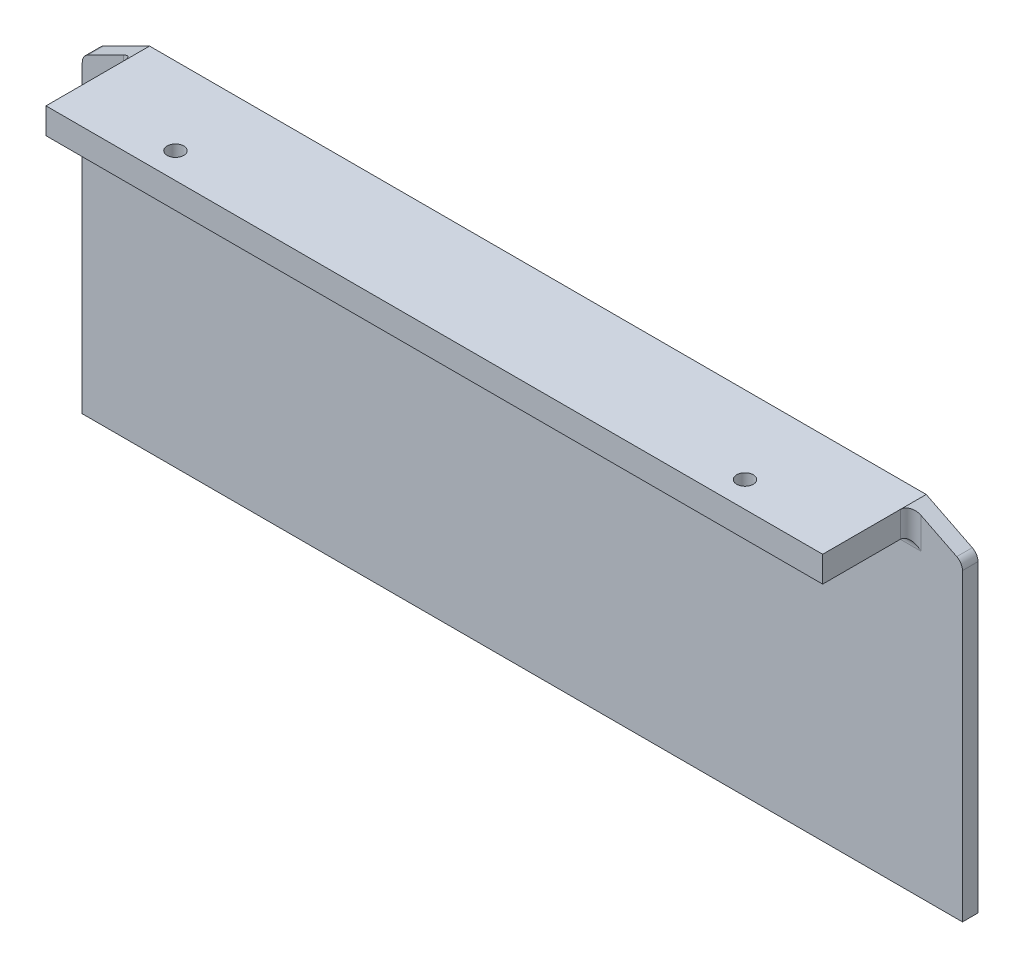
ISO-10303-21;
HEADER;
FILE_DESCRIPTION(('STEP AP214'),'2;1');
FILE_NAME('part.step','',(''),(''),'','','');
FILE_SCHEMA(('AUTOMOTIVE_DESIGN { 1 0 10303 214 1 1 1 1 }'));
ENDSEC;
DATA;
#1=APPLICATION_CONTEXT('core data for automotive mechanical design processes');
#2=APPLICATION_PROTOCOL_DEFINITION('international standard','automotive_design',2000,#1);
#3=PRODUCT_CONTEXT('',#1,'mechanical');
#4=PRODUCT('Part','Part','',(#3));
#5=PRODUCT_RELATED_PRODUCT_CATEGORY('part','',(#4));
#6=PRODUCT_DEFINITION_FORMATION('','',#4);
#7=PRODUCT_DEFINITION_CONTEXT('part definition',#1,'design');
#8=PRODUCT_DEFINITION('design','',#6,#7);
#9=PRODUCT_DEFINITION_SHAPE('','',#8);
#10=(LENGTH_UNIT() NAMED_UNIT(*) SI_UNIT(.MILLI.,.METRE.));
#11=(NAMED_UNIT(*) PLANE_ANGLE_UNIT() SI_UNIT($,.RADIAN.));
#12=(NAMED_UNIT(*) SI_UNIT($,.STERADIAN.) SOLID_ANGLE_UNIT());
#13=UNCERTAINTY_MEASURE_WITH_UNIT(LENGTH_MEASURE(1.E-05),#10,'distance_accuracy_value','');
#14=(GEOMETRIC_REPRESENTATION_CONTEXT(3) GLOBAL_UNCERTAINTY_ASSIGNED_CONTEXT((#13)) GLOBAL_UNIT_ASSIGNED_CONTEXT((#10,
#11,#12)) REPRESENTATION_CONTEXT('',''));
#15=CARTESIAN_POINT('',(0.,0.,0.));
#16=DIRECTION('',(0.,0.,1.));
#17=DIRECTION('',(1.,0.,0.));
#18=AXIS2_PLACEMENT_3D('',#15,#16,#17);
#19=CARTESIAN_POINT('',(0.,5.,0.));
#20=DIRECTION('',(0.,-1.,0.));
#21=DIRECTION('',(0.,0.,-1.));
#22=AXIS2_PLACEMENT_3D('',#19,#20,#21);
#23=PLANE('',#22);
#24=DIRECTION('',(0.,0.,-1.));
#25=VECTOR('',#24,1.);
#26=CARTESIAN_POINT('',(75.,5.,10.));
#27=LINE('',#26,#25);
#28=CARTESIAN_POINT('',(75.,5.,10.));
#29=VERTEX_POINT('',#28);
#30=CARTESIAN_POINT('',(75.,5.,-5.));
#31=VERTEX_POINT('',#30);
#32=EDGE_CURVE('E205',#29,#31,#27,.T.);
#33=ORIENTED_EDGE('',*,*,#32,.T.);
#34=CARTESIAN_POINT('',(75.,5.,-10.));
#35=VERTEX_POINT('',#34);
#36=EDGE_CURVE('E75',#31,#35,#27,.T.);
#37=ORIENTED_EDGE('',*,*,#36,.T.);
#38=DIRECTION('',(-1.,0.,0.));
#39=VECTOR('',#38,1.);
#40=CARTESIAN_POINT('',(-75.,5.,-10.));
#41=LINE('',#40,#39);
#42=CARTESIAN_POINT('',(-75.,5.,-10.));
#43=VERTEX_POINT('',#42);
#44=EDGE_CURVE('E138',#35,#43,#41,.T.);
#45=ORIENTED_EDGE('',*,*,#44,.T.);
#46=DIRECTION('',(0.,0.,1.));
#47=VECTOR('',#46,1.);
#48=CARTESIAN_POINT('',(-75.,5.,10.));
#49=LINE('',#48,#47);
#50=CARTESIAN_POINT('',(-75.,5.,-5.));
#51=VERTEX_POINT('',#50);
#52=EDGE_CURVE('E52',#43,#51,#49,.T.);
#53=ORIENTED_EDGE('',*,*,#52,.T.);
#54=CARTESIAN_POINT('',(-75.,5.,10.));
#55=VERTEX_POINT('',#54);
#56=EDGE_CURVE('E209',#51,#55,#49,.T.);
#57=ORIENTED_EDGE('',*,*,#56,.T.);
#58=DIRECTION('',(1.,0.,0.));
#59=VECTOR('',#58,1.);
#60=CARTESIAN_POINT('',(-75.,5.,10.));
#61=LINE('',#60,#59);
#62=EDGE_CURVE('E211',#55,#29,#61,.T.);
#63=ORIENTED_EDGE('',*,*,#62,.T.);
#64=EDGE_LOOP('',(#33,#37,#45,#53,#57,#63));
#65=FACE_BOUND('',#64,.T.);
#66=CARTESIAN_POINT('',(-55.,5.,5.));
#67=DIRECTION('',(0.,1.,0.));
#68=DIRECTION('',(0.,0.,1.));
#69=AXIS2_PLACEMENT_3D('',#66,#67,#68);
#70=CIRCLE('',#69,1.60000000000001);
#71=CARTESIAN_POINT('',(-55.,5.,6.6));
#72=VERTEX_POINT('',#71);
#73=EDGE_CURVE('E199',#72,#72,#70,.T.);
#74=ORIENTED_EDGE('',*,*,#73,.F.);
#75=EDGE_LOOP('',(#74));
#76=FACE_BOUND('',#75,.T.);
#77=CARTESIAN_POINT('',(55.,5.,5.));
#78=DIRECTION('',(0.,1.,0.));
#79=DIRECTION('',(0.,0.,1.));
#80=AXIS2_PLACEMENT_3D('',#77,#78,#79);
#81=CIRCLE('',#80,1.6);
#82=CARTESIAN_POINT('',(55.,5.,6.6));
#83=VERTEX_POINT('',#82);
#84=EDGE_CURVE('E193',#83,#83,#81,.T.);
#85=ORIENTED_EDGE('',*,*,#84,.F.);
#86=EDGE_LOOP('',(#85));
#87=FACE_BOUND('',#86,.T.);
#88=ADVANCED_FACE('F35',(#65,#76,#87),#23,.F.);
#89=CARTESIAN_POINT('',(0.,0.,0.));
#90=DIRECTION('',(0.,-1.,0.));
#91=DIRECTION('',(0.,0.,-1.));
#92=AXIS2_PLACEMENT_3D('',#89,#90,#91);
#93=PLANE('',#92);
#94=DIRECTION('',(0.,0.,1.));
#95=VECTOR('',#94,1.);
#96=CARTESIAN_POINT('',(-75.,0.,10.));
#97=LINE('',#96,#95);
#98=CARTESIAN_POINT('',(-75.,0.,-5.));
#99=VERTEX_POINT('',#98);
#100=CARTESIAN_POINT('',(-75.,0.,10.));
#101=VERTEX_POINT('',#100);
#102=EDGE_CURVE('E215',#99,#101,#97,.T.);
#103=ORIENTED_EDGE('',*,*,#102,.F.);
#104=DIRECTION('',(-1.,0.,0.));
#105=VECTOR('',#104,1.);
#106=CARTESIAN_POINT('',(0.,0.,-5.));
#107=LINE('',#106,#105);
#108=CARTESIAN_POINT('',(75.,0.,-5.));
#109=VERTEX_POINT('',#108);
#110=EDGE_CURVE('E87',#99,#109,#107,.F.);
#111=ORIENTED_EDGE('',*,*,#110,.T.);
#112=DIRECTION('',(0.,0.,-1.));
#113=VECTOR('',#112,1.);
#114=CARTESIAN_POINT('',(75.,0.,10.));
#115=LINE('',#114,#113);
#116=CARTESIAN_POINT('',(75.,0.,10.));
#117=VERTEX_POINT('',#116);
#118=EDGE_CURVE('E202',#117,#109,#115,.T.);
#119=ORIENTED_EDGE('',*,*,#118,.F.);
#120=DIRECTION('',(1.,0.,0.));
#121=VECTOR('',#120,1.);
#122=CARTESIAN_POINT('',(-75.,0.,10.));
#123=LINE('',#122,#121);
#124=EDGE_CURVE('E218',#101,#117,#123,.T.);
#125=ORIENTED_EDGE('',*,*,#124,.F.);
#126=EDGE_LOOP('',(#103,#111,#119,#125));
#127=FACE_BOUND('',#126,.T.);
#128=CARTESIAN_POINT('',(-55.,0.,5.));
#129=DIRECTION('',(0.,1.,0.));
#130=DIRECTION('',(0.,0.,1.));
#131=AXIS2_PLACEMENT_3D('',#128,#129,#130);
#132=CIRCLE('',#131,1.60000000000001);
#133=CARTESIAN_POINT('',(-55.,0.,6.6));
#134=VERTEX_POINT('',#133);
#135=EDGE_CURVE('E196',#134,#134,#132,.T.);
#136=ORIENTED_EDGE('',*,*,#135,.T.);
#137=EDGE_LOOP('',(#136));
#138=FACE_BOUND('',#137,.T.);
#139=CARTESIAN_POINT('',(55.,0.,5.));
#140=DIRECTION('',(0.,1.,0.));
#141=DIRECTION('',(0.,0.,1.));
#142=AXIS2_PLACEMENT_3D('',#139,#140,#141);
#143=CIRCLE('',#142,1.6);
#144=CARTESIAN_POINT('',(55.,0.,6.6));
#145=VERTEX_POINT('',#144);
#146=EDGE_CURVE('E192',#145,#145,#143,.T.);
#147=ORIENTED_EDGE('',*,*,#146,.T.);
#148=EDGE_LOOP('',(#147));
#149=FACE_BOUND('',#148,.T.);
#150=ADVANCED_FACE('F251',(#127,#138,#149),#93,.T.);
#151=CARTESIAN_POINT('',(75.,5.,10.));
#152=DIRECTION('',(-1.,0.,0.));
#153=DIRECTION('',(0.,0.,1.));
#154=AXIS2_PLACEMENT_3D('',#151,#152,#153);
#155=PLANE('',#154);
#156=ORIENTED_EDGE('',*,*,#118,.T.);
#157=DIRECTION('',(0.,1.,0.));
#158=VECTOR('',#157,1.);
#159=CARTESIAN_POINT('',(75.,5.,-5.));
#160=LINE('',#159,#158);
#161=EDGE_CURVE('E231',#109,#31,#160,.T.);
#162=ORIENTED_EDGE('',*,*,#161,.T.);
#163=ORIENTED_EDGE('',*,*,#32,.F.);
#164=DIRECTION('',(0.,-1.,0.));
#165=VECTOR('',#164,1.);
#166=CARTESIAN_POINT('',(75.,5.,10.));
#167=LINE('',#166,#165);
#168=EDGE_CURVE('E213',#29,#117,#167,.T.);
#169=ORIENTED_EDGE('',*,*,#168,.T.);
#170=EDGE_LOOP('',(#156,#162,#163,#169));
#171=FACE_BOUND('',#170,.T.);
#172=ADVANCED_FACE('F259',(#171),#155,.F.);
#173=CARTESIAN_POINT('',(-75.,5.,-10.));
#174=DIRECTION('',(0.,0.,1.));
#175=DIRECTION('',(1.,0.,0.));
#176=AXIS2_PLACEMENT_3D('',#173,#174,#175);
#177=PLANE('',#176);
#178=DIRECTION('',(0.,1.,0.));
#179=VECTOR('',#178,1.);
#180=CARTESIAN_POINT('',(-85.,-60.,-10.));
#181=LINE('',#180,#179);
#182=CARTESIAN_POINT('',(-85.,-60.,-10.));
#183=VERTEX_POINT('',#182);
#184=CARTESIAN_POINT('',(-85.,-1.23606797749983,-10.));
#185=VERTEX_POINT('',#184);
#186=EDGE_CURVE('E190',#183,#185,#181,.T.);
#187=ORIENTED_EDGE('',*,*,#186,.T.);
#188=CARTESIAN_POINT('',(-83.,-1.23606797749983,-10.));
#189=DIRECTION('',(0.,0.,1.));
#190=DIRECTION('',(1.,0.,0.));
#191=AXIS2_PLACEMENT_3D('',#188,#189,#190);
#192=CIRCLE('',#191,2.);
#193=CARTESIAN_POINT('',(-83.8944271909999,0.552786404499994,-10.));
#194=VERTEX_POINT('',#193);
#195=EDGE_CURVE('E61',#185,#194,#192,.F.);
#196=ORIENTED_EDGE('',*,*,#195,.T.);
#197=DIRECTION('',(0.894427190999914,0.447213595499962,0.));
#198=VECTOR('',#197,1.);
#199=CARTESIAN_POINT('',(-75.,5.,-10.));
#200=LINE('',#199,#198);
#201=EDGE_CURVE('E139',#194,#43,#200,.T.);
#202=ORIENTED_EDGE('',*,*,#201,.T.);
#203=ORIENTED_EDGE('',*,*,#44,.F.);
#204=DIRECTION('',(0.894427190999914,-0.447213595499962,0.));
#205=VECTOR('',#204,1.);
#206=CARTESIAN_POINT('',(-44.9999999999995,65.0000000000004,-10.));
#207=LINE('',#206,#205);
#208=CARTESIAN_POINT('',(83.8944271909999,0.552786404499975,-10.));
#209=VERTEX_POINT('',#208);
#210=EDGE_CURVE('E126',#35,#209,#207,.T.);
#211=ORIENTED_EDGE('',*,*,#210,.T.);
#212=CARTESIAN_POINT('',(83.,-1.23606797749984,-10.));
#213=DIRECTION('',(0.,0.,1.));
#214=DIRECTION('',(1.,0.,0.));
#215=AXIS2_PLACEMENT_3D('',#212,#213,#214);
#216=CIRCLE('',#215,2.);
#217=CARTESIAN_POINT('',(85.,-1.23606797749984,-10.));
#218=VERTEX_POINT('',#217);
#219=EDGE_CURVE('E136',#209,#218,#216,.F.);
#220=ORIENTED_EDGE('',*,*,#219,.T.);
#221=DIRECTION('',(0.,1.,0.));
#222=VECTOR('',#221,1.);
#223=CARTESIAN_POINT('',(85.,-60.,-10.));
#224=LINE('',#223,#222);
#225=CARTESIAN_POINT('',(85.,-60.,-10.));
#226=VERTEX_POINT('',#225);
#227=EDGE_CURVE('E188',#226,#218,#224,.T.);
#228=ORIENTED_EDGE('',*,*,#227,.F.);
#229=DIRECTION('',(1.,0.,0.));
#230=VECTOR('',#229,1.);
#231=CARTESIAN_POINT('',(-85.,-60.,-10.));
#232=LINE('',#231,#230);
#233=EDGE_CURVE('E167',#183,#226,#232,.T.);
#234=ORIENTED_EDGE('',*,*,#233,.F.);
#235=EDGE_LOOP('',(#187,#196,#202,#203,#211,#220,#228,#234));
#236=FACE_BOUND('',#235,.T.);
#237=ADVANCED_FACE('F134',(#236),#177,.F.);
#238=CARTESIAN_POINT('',(-75.,5.,10.));
#239=DIRECTION('',(1.,0.,0.));
#240=DIRECTION('',(0.,0.,-1.));
#241=AXIS2_PLACEMENT_3D('',#238,#239,#240);
#242=PLANE('',#241);
#243=ORIENTED_EDGE('',*,*,#56,.F.);
#244=DIRECTION('',(0.,-1.,0.));
#245=VECTOR('',#244,1.);
#246=CARTESIAN_POINT('',(-75.,0.,-5.));
#247=LINE('',#246,#245);
#248=EDGE_CURVE('E148',#51,#99,#247,.T.);
#249=ORIENTED_EDGE('',*,*,#248,.T.);
#250=ORIENTED_EDGE('',*,*,#102,.T.);
#251=DIRECTION('',(0.,-1.,0.));
#252=VECTOR('',#251,1.);
#253=CARTESIAN_POINT('',(-75.,5.,10.));
#254=LINE('',#253,#252);
#255=EDGE_CURVE('E223',#55,#101,#254,.T.);
#256=ORIENTED_EDGE('',*,*,#255,.F.);
#257=EDGE_LOOP('',(#243,#249,#250,#256));
#258=FACE_BOUND('',#257,.T.);
#259=ADVANCED_FACE('F245',(#258),#242,.F.);
#260=CARTESIAN_POINT('',(-75.,5.,10.));
#261=DIRECTION('',(0.,0.,-1.));
#262=DIRECTION('',(-1.,0.,0.));
#263=AXIS2_PLACEMENT_3D('',#260,#261,#262);
#264=PLANE('',#263);
#265=ORIENTED_EDGE('',*,*,#124,.T.);
#266=ORIENTED_EDGE('',*,*,#168,.F.);
#267=ORIENTED_EDGE('',*,*,#62,.F.);
#268=ORIENTED_EDGE('',*,*,#255,.T.);
#269=EDGE_LOOP('',(#265,#266,#267,#268));
#270=FACE_BOUND('',#269,.T.);
#271=ADVANCED_FACE('F264',(#270),#264,.F.);
#272=CARTESIAN_POINT('',(-55.,5.,5.));
#273=DIRECTION('',(0.,-1.,0.));
#274=DIRECTION('',(0.,0.,-1.));
#275=AXIS2_PLACEMENT_3D('',#272,#273,#274);
#276=CYLINDRICAL_SURFACE('',#275,1.60000000000001);
#277=ORIENTED_EDGE('',*,*,#73,.T.);
#278=EDGE_LOOP('',(#277));
#279=FACE_BOUND('',#278,.T.);
#280=ORIENTED_EDGE('',*,*,#135,.F.);
#281=EDGE_LOOP('',(#280));
#282=FACE_BOUND('',#281,.T.);
#283=ADVANCED_FACE('F313',(#279,#282),#276,.F.);
#284=CARTESIAN_POINT('',(55.,5.,5.));
#285=DIRECTION('',(0.,-1.,0.));
#286=DIRECTION('',(0.,0.,-1.));
#287=AXIS2_PLACEMENT_3D('',#284,#285,#286);
#288=CYLINDRICAL_SURFACE('',#287,1.6);
#289=ORIENTED_EDGE('',*,*,#84,.T.);
#290=EDGE_LOOP('',(#289));
#291=FACE_BOUND('',#290,.T.);
#292=ORIENTED_EDGE('',*,*,#146,.F.);
#293=EDGE_LOOP('',(#292));
#294=FACE_BOUND('',#293,.T.);
#295=ADVANCED_FACE('F345',(#291,#294),#288,.F.);
#296=CARTESIAN_POINT('',(-85.,-60.,-10.));
#297=DIRECTION('',(1.,0.,0.));
#298=DIRECTION('',(0.,0.,-1.));
#299=AXIS2_PLACEMENT_3D('',#296,#297,#298);
#300=PLANE('',#299);
#301=DIRECTION('',(0.,1.,0.));
#302=VECTOR('',#301,1.);
#303=CARTESIAN_POINT('',(-85.,-60.,-7.));
#304=LINE('',#303,#302);
#305=CARTESIAN_POINT('',(-85.,-60.,-7.));
#306=VERTEX_POINT('',#305);
#307=CARTESIAN_POINT('',(-85.,-1.23606797749982,-7.));
#308=VERTEX_POINT('',#307);
#309=EDGE_CURVE('E182',#306,#308,#304,.T.);
#310=ORIENTED_EDGE('',*,*,#309,.T.);
#311=DIRECTION('',(0.,0.,-1.));
#312=VECTOR('',#311,1.);
#313=CARTESIAN_POINT('',(-85.,-1.23606797749983,-10.0000000000001));
#314=LINE('',#313,#312);
#315=EDGE_CURVE('E143',#308,#185,#314,.T.);
#316=ORIENTED_EDGE('',*,*,#315,.T.);
#317=ORIENTED_EDGE('',*,*,#186,.F.);
#318=DIRECTION('',(0.,0.,-1.));
#319=VECTOR('',#318,1.);
#320=CARTESIAN_POINT('',(-85.,-60.,-10.));
#321=LINE('',#320,#319);
#322=EDGE_CURVE('E162',#306,#183,#321,.T.);
#323=ORIENTED_EDGE('',*,*,#322,.F.);
#324=EDGE_LOOP('',(#310,#316,#317,#323));
#325=FACE_BOUND('',#324,.T.);
#326=ADVANCED_FACE('F289',(#325),#300,.F.);
#327=CARTESIAN_POINT('',(85.,-60.,-10.));
#328=DIRECTION('',(-1.,0.,0.));
#329=DIRECTION('',(0.,0.,1.));
#330=AXIS2_PLACEMENT_3D('',#327,#328,#329);
#331=PLANE('',#330);
#332=ORIENTED_EDGE('',*,*,#227,.T.);
#333=DIRECTION('',(0.,0.,1.));
#334=VECTOR('',#333,1.);
#335=CARTESIAN_POINT('',(85.,-1.23606797749984,-10.0000000000001));
#336=LINE('',#335,#334);
#337=CARTESIAN_POINT('',(85.,-1.23606797749983,-7.));
#338=VERTEX_POINT('',#337);
#339=EDGE_CURVE('E131',#218,#338,#336,.T.);
#340=ORIENTED_EDGE('',*,*,#339,.T.);
#341=DIRECTION('',(0.,1.,0.));
#342=VECTOR('',#341,1.);
#343=CARTESIAN_POINT('',(85.,-60.,-7.));
#344=LINE('',#343,#342);
#345=CARTESIAN_POINT('',(85.,-60.,-7.));
#346=VERTEX_POINT('',#345);
#347=EDGE_CURVE('E185',#346,#338,#344,.T.);
#348=ORIENTED_EDGE('',*,*,#347,.F.);
#349=DIRECTION('',(0.,0.,1.));
#350=VECTOR('',#349,1.);
#351=CARTESIAN_POINT('',(85.,-60.,-10.));
#352=LINE('',#351,#350);
#353=EDGE_CURVE('E175',#226,#346,#352,.T.);
#354=ORIENTED_EDGE('',*,*,#353,.F.);
#355=EDGE_LOOP('',(#332,#340,#348,#354));
#356=FACE_BOUND('',#355,.T.);
#357=ADVANCED_FACE('F283',(#356),#331,.F.);
#358=CARTESIAN_POINT('',(-85.,-60.,-7.));
#359=DIRECTION('',(0.,0.,-1.));
#360=DIRECTION('',(-1.,0.,0.));
#361=AXIS2_PLACEMENT_3D('',#358,#359,#360);
#362=PLANE('',#361);
#363=DIRECTION('',(-0.894427190999914,-0.447213595499962,0.));
#364=VECTOR('',#363,1.);
#365=CARTESIAN_POINT('',(-109.,-12.0000000000002,-7.));
#366=LINE('',#365,#364);
#367=CARTESIAN_POINT('',(-77.,3.99999999999999,-7.));
#368=VERTEX_POINT('',#367);
#369=CARTESIAN_POINT('',(-83.8944271909999,0.552786404500001,-7.));
#370=VERTEX_POINT('',#369);
#371=EDGE_CURVE('E226',#368,#370,#366,.T.);
#372=ORIENTED_EDGE('',*,*,#371,.T.);
#373=CARTESIAN_POINT('',(-83.,-1.23606797749982,-7.));
#374=DIRECTION('',(0.,0.,-1.));
#375=DIRECTION('',(-1.,0.,0.));
#376=AXIS2_PLACEMENT_3D('',#373,#374,#375);
#377=CIRCLE('',#376,2.);
#378=EDGE_CURVE('E242',#370,#308,#377,.F.);
#379=ORIENTED_EDGE('',*,*,#378,.T.);
#380=ORIENTED_EDGE('',*,*,#309,.F.);
#381=DIRECTION('',(-1.,0.,0.));
#382=VECTOR('',#381,1.);
#383=CARTESIAN_POINT('',(-85.,-60.,-7.));
#384=LINE('',#383,#382);
#385=EDGE_CURVE('E180',#346,#306,#384,.T.);
#386=ORIENTED_EDGE('',*,*,#385,.F.);
#387=ORIENTED_EDGE('',*,*,#347,.T.);
#388=CARTESIAN_POINT('',(83.,-1.23606797749983,-7.));
#389=DIRECTION('',(0.,0.,-1.));
#390=DIRECTION('',(-1.,0.,0.));
#391=AXIS2_PLACEMENT_3D('',#388,#389,#390);
#392=CIRCLE('',#391,2.);
#393=CARTESIAN_POINT('',(83.8944271909999,0.552786404500002,-7.));
#394=VERTEX_POINT('',#393);
#395=EDGE_CURVE('E234',#338,#394,#392,.F.);
#396=ORIENTED_EDGE('',*,*,#395,.T.);
#397=DIRECTION('',(-0.894427190999914,0.447213595499962,0.));
#398=VECTOR('',#397,1.);
#399=CARTESIAN_POINT('',(-26.9999999999993,56.0000000000002,-7.));
#400=LINE('',#399,#398);
#401=CARTESIAN_POINT('',(77.,4.,-7.));
#402=VERTEX_POINT('',#401);
#403=EDGE_CURVE('E128',#394,#402,#400,.T.);
#404=ORIENTED_EDGE('',*,*,#403,.T.);
#405=DIRECTION('',(0.,1.,0.));
#406=VECTOR('',#405,1.);
#407=CARTESIAN_POINT('',(77.,0.,-7.));
#408=LINE('',#407,#406);
#409=CARTESIAN_POINT('',(77.,-2.,-7.));
#410=VERTEX_POINT('',#409);
#411=EDGE_CURVE('E240',#402,#410,#408,.F.);
#412=ORIENTED_EDGE('',*,*,#411,.T.);
#413=DIRECTION('',(-1.,0.,0.));
#414=VECTOR('',#413,1.);
#415=CARTESIAN_POINT('',(-85.,-2.,-7.));
#416=LINE('',#415,#414);
#417=CARTESIAN_POINT('',(-77.,-2.,-7.));
#418=VERTEX_POINT('',#417);
#419=EDGE_CURVE('E236',#410,#418,#416,.T.);
#420=ORIENTED_EDGE('',*,*,#419,.T.);
#421=DIRECTION('',(0.,-1.,0.));
#422=VECTOR('',#421,1.);
#423=CARTESIAN_POINT('',(-77.,5.,-7.));
#424=LINE('',#423,#422);
#425=EDGE_CURVE('E238',#418,#368,#424,.F.);
#426=ORIENTED_EDGE('',*,*,#425,.T.);
#427=EDGE_LOOP('',(#372,#379,#380,#386,#387,#396,#404,#412,#420,#426));
#428=FACE_BOUND('',#427,.T.);
#429=ADVANCED_FACE('F285',(#428),#362,.F.);
#430=CARTESIAN_POINT('',(0.,-60.,0.));
#431=DIRECTION('',(0.,1.,0.));
#432=DIRECTION('',(0.,0.,1.));
#433=AXIS2_PLACEMENT_3D('',#430,#431,#432);
#434=PLANE('',#433);
#435=ORIENTED_EDGE('',*,*,#322,.T.);
#436=ORIENTED_EDGE('',*,*,#233,.T.);
#437=ORIENTED_EDGE('',*,*,#353,.T.);
#438=ORIENTED_EDGE('',*,*,#385,.T.);
#439=EDGE_LOOP('',(#435,#436,#437,#438));
#440=FACE_BOUND('',#439,.T.);
#441=ADVANCED_FACE('F278',(#440),#434,.F.);
#442=CARTESIAN_POINT('',(-75.,5.,10.));
#443=DIRECTION('',(0.447213595499962,-0.894427190999914,0.));
#444=DIRECTION('',(0.,0.,1.));
#445=AXIS2_PLACEMENT_3D('',#442,#443,#444);
#446=PLANE('',#445);
#447=ORIENTED_EDGE('',*,*,#201,.F.);
#448=DIRECTION('',(0.,0.,-1.));
#449=VECTOR('',#448,1.);
#450=CARTESIAN_POINT('',(-83.8944271909998,0.552786404500041,10.0000000000001));
#451=LINE('',#450,#449);
#452=EDGE_CURVE('E145',#194,#370,#451,.F.);
#453=ORIENTED_EDGE('',*,*,#452,.T.);
#454=ORIENTED_EDGE('',*,*,#371,.F.);
#455=CARTESIAN_POINT('',(-77.,3.99999999999999,-5.));
#456=DIRECTION('',(0.447213595499962,-0.894427190999914,0.));
#457=DIRECTION('',(0.894427190999914,0.447213595499962,0.));
#458=AXIS2_PLACEMENT_3D('',#455,#456,#457);
#459=ELLIPSE('',#458,2.23606797749979,2.);
#460=EDGE_CURVE('E11',#368,#51,#459,.T.);
#461=ORIENTED_EDGE('',*,*,#460,.T.);
#462=ORIENTED_EDGE('',*,*,#52,.F.);
#463=EDGE_LOOP('',(#447,#453,#454,#461,#462));
#464=FACE_BOUND('',#463,.T.);
#465=ADVANCED_FACE('F295',(#464),#446,.F.);
#466=CARTESIAN_POINT('',(75.,5.,10.));
#467=DIRECTION('',(-0.447213595499962,-0.894427190999914,0.));
#468=DIRECTION('',(0.,0.,-1.));
#469=AXIS2_PLACEMENT_3D('',#466,#467,#468);
#470=PLANE('',#469);
#471=ORIENTED_EDGE('',*,*,#403,.F.);
#472=DIRECTION('',(0.,0.,1.));
#473=VECTOR('',#472,1.);
#474=CARTESIAN_POINT('',(83.8944271909998,0.552786404500033,10.0000000000001));
#475=LINE('',#474,#473);
#476=EDGE_CURVE('E122',#394,#209,#475,.F.);
#477=ORIENTED_EDGE('',*,*,#476,.T.);
#478=ORIENTED_EDGE('',*,*,#210,.F.);
#479=ORIENTED_EDGE('',*,*,#36,.F.);
#480=CARTESIAN_POINT('',(77.,3.99999999999999,-5.));
#481=DIRECTION('',(-0.447213595499962,-0.894427190999914,0.));
#482=DIRECTION('',(0.894427190999914,-0.447213595499962,0.));
#483=AXIS2_PLACEMENT_3D('',#480,#481,#482);
#484=ELLIPSE('',#483,2.23606797749979,2.);
#485=EDGE_CURVE('E44',#31,#402,#484,.T.);
#486=ORIENTED_EDGE('',*,*,#485,.T.);
#487=EDGE_LOOP('',(#471,#477,#478,#479,#486));
#488=FACE_BOUND('',#487,.T.);
#489=ADVANCED_FACE('F124',(#488),#470,.F.);
#490=CARTESIAN_POINT('',(-77.,5.,-5.));
#491=DIRECTION('',(0.,1.,0.));
#492=DIRECTION('',(0.,0.,1.));
#493=AXIS2_PLACEMENT_3D('',#490,#491,#492);
#494=CYLINDRICAL_SURFACE('',#493,2.);
#495=ORIENTED_EDGE('',*,*,#460,.F.);
#496=ORIENTED_EDGE('',*,*,#425,.F.);
#497=CARTESIAN_POINT('',(-77.,-2.,-5.));
#498=DIRECTION('',(-0.707106781186547,0.707106781186547,0.));
#499=DIRECTION('',(-0.707106781186547,-0.707106781186547,0.));
#500=AXIS2_PLACEMENT_3D('',#497,#498,#499);
#501=ELLIPSE('',#500,2.82842712474619,2.);
#502=EDGE_CURVE('E39',#99,#418,#501,.T.);
#503=ORIENTED_EDGE('',*,*,#502,.F.);
#504=ORIENTED_EDGE('',*,*,#248,.F.);
#505=EDGE_LOOP('',(#495,#496,#503,#504));
#506=FACE_BOUND('',#505,.T.);
#507=ADVANCED_FACE('F254',(#506),#494,.F.);
#508=CARTESIAN_POINT('',(-85.,-2.,-5.));
#509=DIRECTION('',(-1.,0.,0.));
#510=DIRECTION('',(0.,0.,1.));
#511=AXIS2_PLACEMENT_3D('',#508,#509,#510);
#512=CYLINDRICAL_SURFACE('',#511,2.);
#513=ORIENTED_EDGE('',*,*,#502,.T.);
#514=ORIENTED_EDGE('',*,*,#419,.F.);
#515=CARTESIAN_POINT('',(77.,-2.,-5.));
#516=DIRECTION('',(-0.707106781186547,-0.707106781186547,0.));
#517=DIRECTION('',(-0.707106781186547,0.707106781186547,0.));
#518=AXIS2_PLACEMENT_3D('',#515,#516,#517);
#519=ELLIPSE('',#518,2.82842712474619,2.);
#520=EDGE_CURVE('E155',#109,#410,#519,.T.);
#521=ORIENTED_EDGE('',*,*,#520,.F.);
#522=ORIENTED_EDGE('',*,*,#110,.F.);
#523=EDGE_LOOP('',(#513,#514,#521,#522));
#524=FACE_BOUND('',#523,.T.);
#525=ADVANCED_FACE('F255',(#524),#512,.F.);
#526=CARTESIAN_POINT('',(77.,5.,-5.));
#527=DIRECTION('',(0.,-1.,0.));
#528=DIRECTION('',(0.,0.,-1.));
#529=AXIS2_PLACEMENT_3D('',#526,#527,#528);
#530=CYLINDRICAL_SURFACE('',#529,2.);
#531=ORIENTED_EDGE('',*,*,#520,.T.);
#532=ORIENTED_EDGE('',*,*,#411,.F.);
#533=ORIENTED_EDGE('',*,*,#485,.F.);
#534=ORIENTED_EDGE('',*,*,#161,.F.);
#535=EDGE_LOOP('',(#531,#532,#533,#534));
#536=FACE_BOUND('',#535,.T.);
#537=ADVANCED_FACE('F256',(#536),#530,.F.);
#538=CARTESIAN_POINT('',(-83.,-1.23606797749983,-10.0000000000001));
#539=DIRECTION('',(0.,0.,-1.));
#540=DIRECTION('',(-1.,0.,0.));
#541=AXIS2_PLACEMENT_3D('',#538,#539,#540);
#542=CYLINDRICAL_SURFACE('',#541,2.);
#543=ORIENTED_EDGE('',*,*,#378,.F.);
#544=ORIENTED_EDGE('',*,*,#452,.F.);
#545=ORIENTED_EDGE('',*,*,#195,.F.);
#546=ORIENTED_EDGE('',*,*,#315,.F.);
#547=EDGE_LOOP('',(#543,#544,#545,#546));
#548=FACE_BOUND('',#547,.T.);
#549=ADVANCED_FACE('F291',(#548),#542,.T.);
#550=CARTESIAN_POINT('',(83.,-1.23606797749984,-10.0000000000001));
#551=DIRECTION('',(0.,0.,1.));
#552=DIRECTION('',(1.,0.,0.));
#553=AXIS2_PLACEMENT_3D('',#550,#551,#552);
#554=CYLINDRICAL_SURFACE('',#553,2.);
#555=ORIENTED_EDGE('',*,*,#219,.F.);
#556=ORIENTED_EDGE('',*,*,#476,.F.);
#557=ORIENTED_EDGE('',*,*,#395,.F.);
#558=ORIENTED_EDGE('',*,*,#339,.F.);
#559=EDGE_LOOP('',(#555,#556,#557,#558));
#560=FACE_BOUND('',#559,.T.);
#561=ADVANCED_FACE('F37',(#560),#554,.T.);
#562=CLOSED_SHELL('',(#88,#150,#172,#237,#259,#271,#283,#295,#326,#357,#429,#441,#465,#489,#507,
#525,#537,#549,#561));
#563=MANIFOLD_SOLID_BREP('B2',#562);
#564=ADVANCED_BREP_SHAPE_REPRESENTATION('',(#18,#563),#14);
#565=SHAPE_DEFINITION_REPRESENTATION(#9,#564);
ENDSEC;
END-ISO-10303-21;
